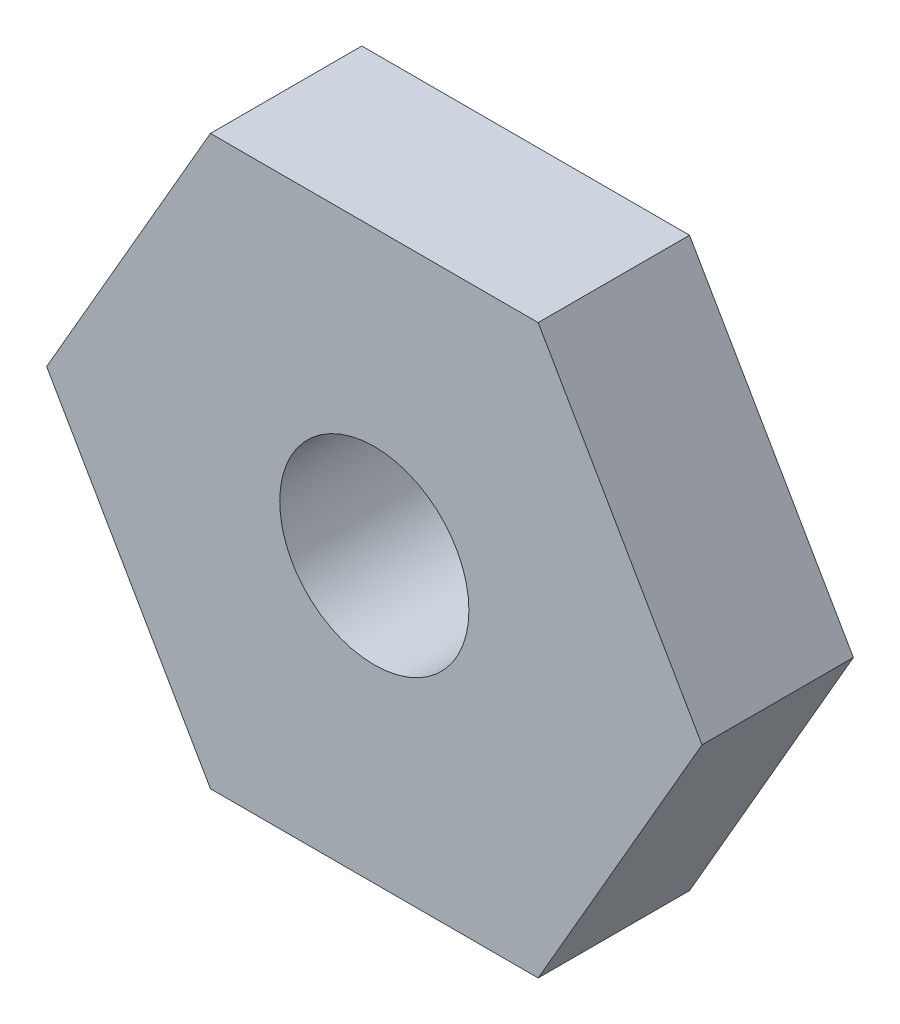
ISO-10303-21;
HEADER;
FILE_DESCRIPTION(('STEP AP214'),'2;1');
FILE_NAME('part.step','',(''),(''),'','','');
FILE_SCHEMA(('AUTOMOTIVE_DESIGN { 1 0 10303 214 1 1 1 1 }'));
ENDSEC;
DATA;
#1=APPLICATION_CONTEXT('core data for automotive mechanical design processes');
#2=APPLICATION_PROTOCOL_DEFINITION('international standard','automotive_design',2000,#1);
#3=PRODUCT_CONTEXT('',#1,'mechanical');
#4=PRODUCT('Part','Part','',(#3));
#5=PRODUCT_RELATED_PRODUCT_CATEGORY('part','',(#4));
#6=PRODUCT_DEFINITION_FORMATION('','',#4);
#7=PRODUCT_DEFINITION_CONTEXT('part definition',#1,'design');
#8=PRODUCT_DEFINITION('design','',#6,#7);
#9=PRODUCT_DEFINITION_SHAPE('','',#8);
#10=(LENGTH_UNIT() NAMED_UNIT(*) SI_UNIT(.MILLI.,.METRE.));
#11=(NAMED_UNIT(*) PLANE_ANGLE_UNIT() SI_UNIT($,.RADIAN.));
#12=(NAMED_UNIT(*) SI_UNIT($,.STERADIAN.) SOLID_ANGLE_UNIT());
#13=UNCERTAINTY_MEASURE_WITH_UNIT(LENGTH_MEASURE(1.E-05),#10,'distance_accuracy_value','');
#14=(GEOMETRIC_REPRESENTATION_CONTEXT(3) GLOBAL_UNCERTAINTY_ASSIGNED_CONTEXT((#13)) GLOBAL_UNIT_ASSIGNED_CONTEXT((#10,
#11,#12)) REPRESENTATION_CONTEXT('',''));
#15=CARTESIAN_POINT('',(0.,0.,0.));
#16=DIRECTION('',(0.,0.,1.));
#17=DIRECTION('',(1.,0.,0.));
#18=AXIS2_PLACEMENT_3D('',#15,#16,#17);
#19=CARTESIAN_POINT('',(8.66025403784439,-15.,4.));
#20=DIRECTION('',(-0.866025403784439,0.5,0.));
#21=DIRECTION('',(-0.5,-0.866025403784439,0.));
#22=AXIS2_PLACEMENT_3D('',#19,#20,#21);
#23=PLANE('',#22);
#24=DIRECTION('',(0.5,0.866025403784439,0.));
#25=VECTOR('',#24,1.);
#26=CARTESIAN_POINT('',(8.66025403784439,-15.,-4.));
#27=LINE('',#26,#25);
#28=CARTESIAN_POINT('',(8.66025403784439,-15.,-4.));
#29=VERTEX_POINT('',#28);
#30=CARTESIAN_POINT('',(17.3205080756888,0.,-4.));
#31=VERTEX_POINT('',#30);
#32=EDGE_CURVE('E142',#29,#31,#27,.T.);
#33=ORIENTED_EDGE('',*,*,#32,.T.);
#34=DIRECTION('',(0.,0.,-1.));
#35=VECTOR('',#34,1.);
#36=CARTESIAN_POINT('',(17.3205080756888,0.,4.));
#37=LINE('',#36,#35);
#38=CARTESIAN_POINT('',(17.3205080756888,0.,4.));
#39=VERTEX_POINT('',#38);
#40=EDGE_CURVE('E11',#39,#31,#37,.T.);
#41=ORIENTED_EDGE('',*,*,#40,.F.);
#42=DIRECTION('',(0.5,0.866025403784439,0.));
#43=VECTOR('',#42,1.);
#44=CARTESIAN_POINT('',(8.66025403784439,-15.,4.));
#45=LINE('',#44,#43);
#46=CARTESIAN_POINT('',(8.66025403784439,-15.,4.));
#47=VERTEX_POINT('',#46);
#48=EDGE_CURVE('E159',#47,#39,#45,.T.);
#49=ORIENTED_EDGE('',*,*,#48,.F.);
#50=DIRECTION('',(0.,0.,-1.));
#51=VECTOR('',#50,1.);
#52=CARTESIAN_POINT('',(8.66025403784439,-15.,4.));
#53=LINE('',#52,#51);
#54=EDGE_CURVE('E138',#47,#29,#53,.T.);
#55=ORIENTED_EDGE('',*,*,#54,.T.);
#56=EDGE_LOOP('',(#33,#41,#49,#55));
#57=FACE_BOUND('',#56,.T.);
#58=ADVANCED_FACE('F51',(#57),#23,.F.);
#59=CARTESIAN_POINT('',(17.3205080756888,0.,4.));
#60=DIRECTION('',(-0.866025403784439,-0.5,0.));
#61=DIRECTION('',(0.5,-0.866025403784439,0.));
#62=AXIS2_PLACEMENT_3D('',#59,#60,#61);
#63=PLANE('',#62);
#64=DIRECTION('',(-0.5,0.866025403784439,0.));
#65=VECTOR('',#64,1.);
#66=CARTESIAN_POINT('',(17.3205080756888,0.,-4.));
#67=LINE('',#66,#65);
#68=CARTESIAN_POINT('',(8.66025403784439,15.,-4.));
#69=VERTEX_POINT('',#68);
#70=EDGE_CURVE('E146',#31,#69,#67,.T.);
#71=ORIENTED_EDGE('',*,*,#70,.T.);
#72=DIRECTION('',(0.,0.,-1.));
#73=VECTOR('',#72,1.);
#74=CARTESIAN_POINT('',(8.66025403784439,15.,4.));
#75=LINE('',#74,#73);
#76=CARTESIAN_POINT('',(8.66025403784439,15.,4.));
#77=VERTEX_POINT('',#76);
#78=EDGE_CURVE('E61',#77,#69,#75,.T.);
#79=ORIENTED_EDGE('',*,*,#78,.F.);
#80=DIRECTION('',(-0.5,0.866025403784439,0.));
#81=VECTOR('',#80,1.);
#82=CARTESIAN_POINT('',(17.3205080756888,0.,4.));
#83=LINE('',#82,#81);
#84=EDGE_CURVE('E106',#39,#77,#83,.T.);
#85=ORIENTED_EDGE('',*,*,#84,.F.);
#86=ORIENTED_EDGE('',*,*,#40,.T.);
#87=EDGE_LOOP('',(#71,#79,#85,#86));
#88=FACE_BOUND('',#87,.T.);
#89=ADVANCED_FACE('F187',(#88),#63,.F.);
#90=CARTESIAN_POINT('',(8.66025403784439,15.,4.));
#91=DIRECTION('',(0.,-1.,0.));
#92=DIRECTION('',(1.,0.,0.));
#93=AXIS2_PLACEMENT_3D('',#90,#91,#92);
#94=PLANE('',#93);
#95=DIRECTION('',(-1.,0.,0.));
#96=VECTOR('',#95,1.);
#97=CARTESIAN_POINT('',(8.66025403784439,15.,-4.));
#98=LINE('',#97,#96);
#99=CARTESIAN_POINT('',(-8.66025403784438,15.,-4.));
#100=VERTEX_POINT('',#99);
#101=EDGE_CURVE('E150',#69,#100,#98,.T.);
#102=ORIENTED_EDGE('',*,*,#101,.T.);
#103=DIRECTION('',(0.,0.,-1.));
#104=VECTOR('',#103,1.);
#105=CARTESIAN_POINT('',(-8.66025403784438,15.,4.));
#106=LINE('',#105,#104);
#107=CARTESIAN_POINT('',(-8.66025403784438,15.,4.));
#108=VERTEX_POINT('',#107);
#109=EDGE_CURVE('E130',#108,#100,#106,.T.);
#110=ORIENTED_EDGE('',*,*,#109,.F.);
#111=DIRECTION('',(-1.,0.,0.));
#112=VECTOR('',#111,1.);
#113=CARTESIAN_POINT('',(8.66025403784439,15.,4.));
#114=LINE('',#113,#112);
#115=EDGE_CURVE('E119',#77,#108,#114,.T.);
#116=ORIENTED_EDGE('',*,*,#115,.F.);
#117=ORIENTED_EDGE('',*,*,#78,.T.);
#118=EDGE_LOOP('',(#102,#110,#116,#117));
#119=FACE_BOUND('',#118,.T.);
#120=ADVANCED_FACE('F168',(#119),#94,.F.);
#121=CARTESIAN_POINT('',(-8.66025403784438,15.,4.));
#122=DIRECTION('',(0.866025403784439,-0.5,0.));
#123=DIRECTION('',(0.5,0.866025403784438,0.));
#124=AXIS2_PLACEMENT_3D('',#121,#122,#123);
#125=PLANE('',#124);
#126=DIRECTION('',(-0.5,-0.866025403784438,0.));
#127=VECTOR('',#126,1.);
#128=CARTESIAN_POINT('',(-8.66025403784438,15.,-4.));
#129=LINE('',#128,#127);
#130=CARTESIAN_POINT('',(-17.3205080756888,0.,-4.));
#131=VERTEX_POINT('',#130);
#132=EDGE_CURVE('E128',#100,#131,#129,.T.);
#133=ORIENTED_EDGE('',*,*,#132,.T.);
#134=DIRECTION('',(0.,0.,-1.));
#135=VECTOR('',#134,1.);
#136=CARTESIAN_POINT('',(-17.3205080756888,0.,4.));
#137=LINE('',#136,#135);
#138=CARTESIAN_POINT('',(-17.3205080756888,0.,4.));
#139=VERTEX_POINT('',#138);
#140=EDGE_CURVE('E125',#139,#131,#137,.T.);
#141=ORIENTED_EDGE('',*,*,#140,.F.);
#142=DIRECTION('',(-0.5,-0.866025403784438,0.));
#143=VECTOR('',#142,1.);
#144=CARTESIAN_POINT('',(-8.66025403784438,15.,4.));
#145=LINE('',#144,#143);
#146=EDGE_CURVE('E113',#108,#139,#145,.T.);
#147=ORIENTED_EDGE('',*,*,#146,.F.);
#148=ORIENTED_EDGE('',*,*,#109,.T.);
#149=EDGE_LOOP('',(#133,#141,#147,#148));
#150=FACE_BOUND('',#149,.T.);
#151=ADVANCED_FACE('F126',(#150),#125,.F.);
#152=CARTESIAN_POINT('',(-17.3205080756888,0.,4.));
#153=DIRECTION('',(0.866025403784439,0.5,0.));
#154=DIRECTION('',(-0.5,0.866025403784439,0.));
#155=AXIS2_PLACEMENT_3D('',#152,#153,#154);
#156=PLANE('',#155);
#157=DIRECTION('',(0.5,-0.866025403784439,0.));
#158=VECTOR('',#157,1.);
#159=CARTESIAN_POINT('',(-17.3205080756888,0.,-4.));
#160=LINE('',#159,#158);
#161=CARTESIAN_POINT('',(-8.66025403784439,-15.,-4.));
#162=VERTEX_POINT('',#161);
#163=EDGE_CURVE('E92',#131,#162,#160,.T.);
#164=ORIENTED_EDGE('',*,*,#163,.T.);
#165=DIRECTION('',(0.,0.,-1.));
#166=VECTOR('',#165,1.);
#167=CARTESIAN_POINT('',(-8.66025403784439,-15.,4.));
#168=LINE('',#167,#166);
#169=CARTESIAN_POINT('',(-8.66025403784439,-15.,4.));
#170=VERTEX_POINT('',#169);
#171=EDGE_CURVE('E131',#170,#162,#168,.T.);
#172=ORIENTED_EDGE('',*,*,#171,.F.);
#173=DIRECTION('',(0.5,-0.866025403784439,0.));
#174=VECTOR('',#173,1.);
#175=CARTESIAN_POINT('',(-17.3205080756888,0.,4.));
#176=LINE('',#175,#174);
#177=EDGE_CURVE('E117',#139,#170,#176,.T.);
#178=ORIENTED_EDGE('',*,*,#177,.F.);
#179=ORIENTED_EDGE('',*,*,#140,.T.);
#180=EDGE_LOOP('',(#164,#172,#178,#179));
#181=FACE_BOUND('',#180,.T.);
#182=ADVANCED_FACE('F133',(#181),#156,.F.);
#183=CARTESIAN_POINT('',(-8.66025403784439,-15.,4.));
#184=DIRECTION('',(0.,1.,0.));
#185=DIRECTION('',(-1.,0.,0.));
#186=AXIS2_PLACEMENT_3D('',#183,#184,#185);
#187=PLANE('',#186);
#188=DIRECTION('',(1.,0.,0.));
#189=VECTOR('',#188,1.);
#190=CARTESIAN_POINT('',(-8.66025403784439,-15.,-4.));
#191=LINE('',#190,#189);
#192=EDGE_CURVE('E98',#162,#29,#191,.T.);
#193=ORIENTED_EDGE('',*,*,#192,.T.);
#194=ORIENTED_EDGE('',*,*,#54,.F.);
#195=DIRECTION('',(1.,0.,0.));
#196=VECTOR('',#195,1.);
#197=CARTESIAN_POINT('',(-8.66025403784439,-15.,4.));
#198=LINE('',#197,#196);
#199=EDGE_CURVE('E69',#170,#47,#198,.T.);
#200=ORIENTED_EDGE('',*,*,#199,.F.);
#201=ORIENTED_EDGE('',*,*,#171,.T.);
#202=EDGE_LOOP('',(#193,#194,#200,#201));
#203=FACE_BOUND('',#202,.T.);
#204=ADVANCED_FACE('F175',(#203),#187,.F.);
#205=CARTESIAN_POINT('',(0.,0.,4.));
#206=DIRECTION('',(0.,0.,1.));
#207=DIRECTION('',(1.,0.,0.));
#208=AXIS2_PLACEMENT_3D('',#205,#206,#207);
#209=PLANE('',#208);
#210=CARTESIAN_POINT('',(0.,0.,4.));
#211=DIRECTION('',(0.,0.,1.));
#212=DIRECTION('',(1.,0.,0.));
#213=AXIS2_PLACEMENT_3D('',#210,#211,#212);
#214=CIRCLE('',#213,5.);
#215=CARTESIAN_POINT('',(5.,0.,4.));
#216=VERTEX_POINT('',#215);
#217=EDGE_CURVE('E214',#216,#216,#214,.T.);
#218=ORIENTED_EDGE('',*,*,#217,.F.);
#219=EDGE_LOOP('',(#218));
#220=FACE_BOUND('',#219,.T.);
#221=ORIENTED_EDGE('',*,*,#48,.T.);
#222=ORIENTED_EDGE('',*,*,#84,.T.);
#223=ORIENTED_EDGE('',*,*,#115,.T.);
#224=ORIENTED_EDGE('',*,*,#146,.T.);
#225=ORIENTED_EDGE('',*,*,#177,.T.);
#226=ORIENTED_EDGE('',*,*,#199,.T.);
#227=EDGE_LOOP('',(#221,#222,#223,#224,#225,#226));
#228=FACE_BOUND('',#227,.T.);
#229=ADVANCED_FACE('F115',(#220,#228),#209,.T.);
#230=CARTESIAN_POINT('',(0.,0.,-4.));
#231=DIRECTION('',(0.,0.,1.));
#232=DIRECTION('',(1.,0.,0.));
#233=AXIS2_PLACEMENT_3D('',#230,#231,#232);
#234=PLANE('',#233);
#235=CARTESIAN_POINT('',(0.,0.,-4.));
#236=DIRECTION('',(0.,0.,1.));
#237=DIRECTION('',(1.,0.,0.));
#238=AXIS2_PLACEMENT_3D('',#235,#236,#237);
#239=CIRCLE('',#238,5.);
#240=CARTESIAN_POINT('',(5.,0.,-4.));
#241=VERTEX_POINT('',#240);
#242=EDGE_CURVE('E147',#241,#241,#239,.T.);
#243=ORIENTED_EDGE('',*,*,#242,.T.);
#244=EDGE_LOOP('',(#243));
#245=FACE_BOUND('',#244,.T.);
#246=ORIENTED_EDGE('',*,*,#32,.F.);
#247=ORIENTED_EDGE('',*,*,#192,.F.);
#248=ORIENTED_EDGE('',*,*,#163,.F.);
#249=ORIENTED_EDGE('',*,*,#132,.F.);
#250=ORIENTED_EDGE('',*,*,#101,.F.);
#251=ORIENTED_EDGE('',*,*,#70,.F.);
#252=EDGE_LOOP('',(#246,#247,#248,#249,#250,#251));
#253=FACE_BOUND('',#252,.T.);
#254=ADVANCED_FACE('F171',(#245,#253),#234,.F.);
#255=CARTESIAN_POINT('',(0.,0.,-4.));
#256=DIRECTION('',(0.,0.,1.));
#257=DIRECTION('',(1.,0.,0.));
#258=AXIS2_PLACEMENT_3D('',#255,#256,#257);
#259=CYLINDRICAL_SURFACE('',#258,5.);
#260=ORIENTED_EDGE('',*,*,#242,.F.);
#261=EDGE_LOOP('',(#260));
#262=FACE_BOUND('',#261,.T.);
#263=ORIENTED_EDGE('',*,*,#217,.T.);
#264=EDGE_LOOP('',(#263));
#265=FACE_BOUND('',#264,.T.);
#266=ADVANCED_FACE('F203',(#262,#265),#259,.F.);
#267=CLOSED_SHELL('',(#58,#89,#120,#151,#182,#204,#229,#254,#266));
#268=MANIFOLD_SOLID_BREP('B2',#267);
#269=ADVANCED_BREP_SHAPE_REPRESENTATION('',(#18,#268),#14);
#270=SHAPE_DEFINITION_REPRESENTATION(#9,#269);
ENDSEC;
END-ISO-10303-21;
